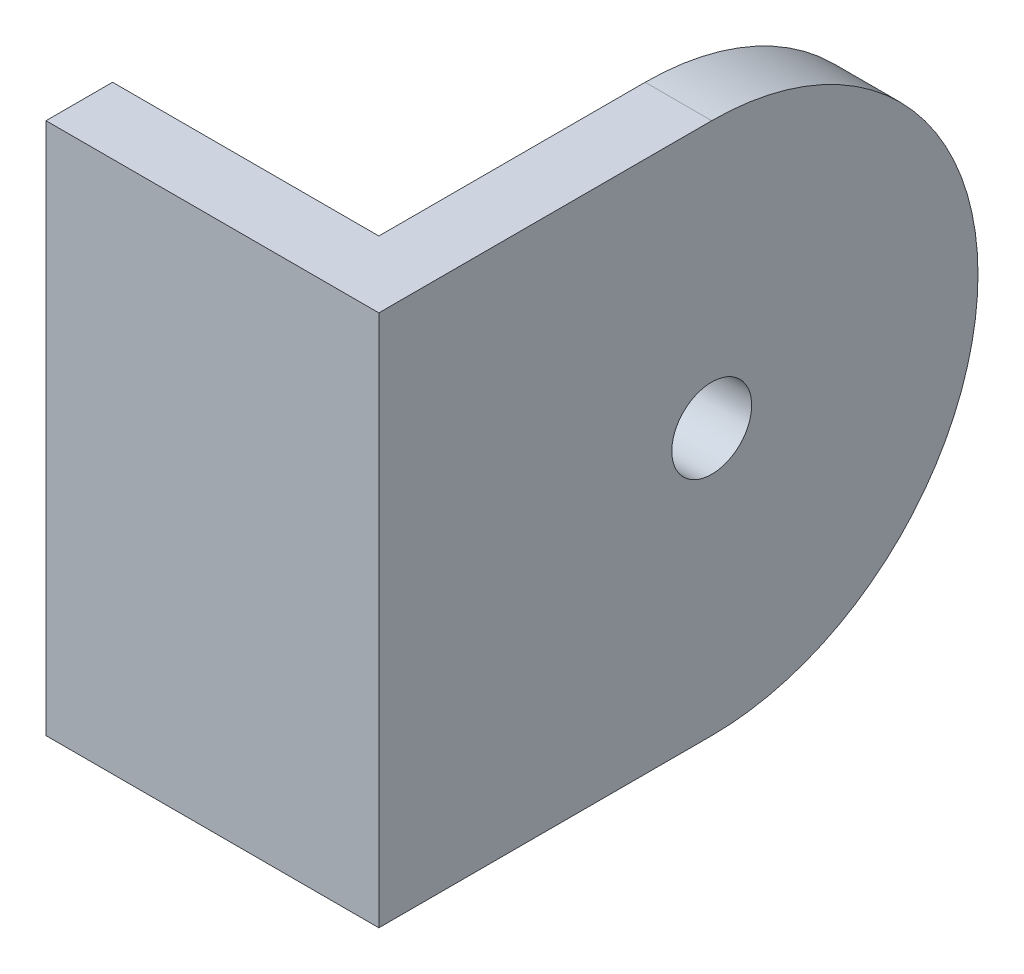
ISO-10303-21;
HEADER;
FILE_DESCRIPTION(('STEP AP214'),'2;1');
FILE_NAME('part.step','',(''),(''),'','','');
FILE_SCHEMA(('AUTOMOTIVE_DESIGN { 1 0 10303 214 1 1 1 1 }'));
ENDSEC;
DATA;
#1=APPLICATION_CONTEXT('core data for automotive mechanical design processes');
#2=APPLICATION_PROTOCOL_DEFINITION('international standard','automotive_design',2000,#1);
#3=PRODUCT_CONTEXT('',#1,'mechanical');
#4=PRODUCT('Part','Part','',(#3));
#5=PRODUCT_RELATED_PRODUCT_CATEGORY('part','',(#4));
#6=PRODUCT_DEFINITION_FORMATION('','',#4);
#7=PRODUCT_DEFINITION_CONTEXT('part definition',#1,'design');
#8=PRODUCT_DEFINITION('design','',#6,#7);
#9=PRODUCT_DEFINITION_SHAPE('','',#8);
#10=(LENGTH_UNIT() NAMED_UNIT(*) SI_UNIT(.MILLI.,.METRE.));
#11=(NAMED_UNIT(*) PLANE_ANGLE_UNIT() SI_UNIT($,.RADIAN.));
#12=(NAMED_UNIT(*) SI_UNIT($,.STERADIAN.) SOLID_ANGLE_UNIT());
#13=UNCERTAINTY_MEASURE_WITH_UNIT(LENGTH_MEASURE(1.E-05),#10,'distance_accuracy_value','');
#14=(GEOMETRIC_REPRESENTATION_CONTEXT(3) GLOBAL_UNCERTAINTY_ASSIGNED_CONTEXT((#13)) GLOBAL_UNIT_ASSIGNED_CONTEXT((#10,
#11,#12)) REPRESENTATION_CONTEXT('',''));
#15=CARTESIAN_POINT('',(0.,0.,0.));
#16=DIRECTION('',(0.,0.,1.));
#17=DIRECTION('',(1.,0.,0.));
#18=AXIS2_PLACEMENT_3D('',#15,#16,#17);
#19=CARTESIAN_POINT('',(-4.41812010102743,20.,24.7985127226701));
#20=DIRECTION('',(1.,0.,0.));
#21=DIRECTION('',(0.,0.,-1.));
#22=AXIS2_PLACEMENT_3D('',#19,#20,#21);
#23=PLANE('',#22);
#24=CARTESIAN_POINT('',(-4.41812010102743,0.,4.79851272267009));
#25=DIRECTION('',(-1.,0.,0.));
#26=DIRECTION('',(0.,0.,1.));
#27=AXIS2_PLACEMENT_3D('',#24,#25,#26);
#28=CIRCLE('',#27,3.);
#29=CARTESIAN_POINT('',(-4.41812010102743,0.,7.79851272267009));
#30=VERTEX_POINT('',#29);
#31=EDGE_CURVE('E251',#30,#30,#28,.T.);
#32=ORIENTED_EDGE('',*,*,#31,.F.);
#33=EDGE_LOOP('',(#32));
#34=FACE_BOUND('',#33,.T.);
#35=DIRECTION('',(0.,0.,1.));
#36=VECTOR('',#35,1.);
#37=CARTESIAN_POINT('',(-4.41812010102743,20.,24.7985127226701));
#38=LINE('',#37,#36);
#39=CARTESIAN_POINT('',(-4.41812010102743,20.,4.79851272267009));
#40=VERTEX_POINT('',#39);
#41=CARTESIAN_POINT('',(-4.41812010102743,20.,24.7985127226701));
#42=VERTEX_POINT('',#41);
#43=EDGE_CURVE('E98',#40,#42,#38,.T.);
#44=ORIENTED_EDGE('',*,*,#43,.F.);
#45=CARTESIAN_POINT('',(-4.41812010102743,0.,4.79851272267009));
#46=DIRECTION('',(1.,0.,0.));
#47=DIRECTION('',(0.,0.,-1.));
#48=AXIS2_PLACEMENT_3D('',#45,#46,#47);
#49=CIRCLE('',#48,20.);
#50=CARTESIAN_POINT('',(-4.41812010102743,0.,-15.2014872773299));
#51=VERTEX_POINT('',#50);
#52=EDGE_CURVE('E49',#40,#51,#49,.F.);
#53=ORIENTED_EDGE('',*,*,#52,.T.);
#54=CARTESIAN_POINT('',(-4.41812010102743,0.,4.79851272267009));
#55=DIRECTION('',(1.,0.,0.));
#56=DIRECTION('',(0.,0.,-1.));
#57=AXIS2_PLACEMENT_3D('',#54,#55,#56);
#58=CIRCLE('',#57,20.);
#59=CARTESIAN_POINT('',(-4.41812010102743,-20.,4.79851272267009));
#60=VERTEX_POINT('',#59);
#61=EDGE_CURVE('E127',#51,#60,#58,.F.);
#62=ORIENTED_EDGE('',*,*,#61,.T.);
#63=DIRECTION('',(0.,0.,1.));
#64=VECTOR('',#63,1.);
#65=CARTESIAN_POINT('',(-4.41812010102743,-20.,24.7985127226701));
#66=LINE('',#65,#64);
#67=CARTESIAN_POINT('',(-4.41812010102743,-20.,24.7985127226701));
#68=VERTEX_POINT('',#67);
#69=EDGE_CURVE('E120',#60,#68,#66,.T.);
#70=ORIENTED_EDGE('',*,*,#69,.T.);
#71=DIRECTION('',(0.,-1.,0.));
#72=VECTOR('',#71,1.);
#73=CARTESIAN_POINT('',(-4.41812010102743,20.,24.7985127226701));
#74=LINE('',#73,#72);
#75=EDGE_CURVE('E112',#42,#68,#74,.T.);
#76=ORIENTED_EDGE('',*,*,#75,.F.);
#77=EDGE_LOOP('',(#44,#53,#62,#70,#76));
#78=FACE_BOUND('',#77,.T.);
#79=ADVANCED_FACE('F39',(#34,#78),#23,.F.);
#80=CARTESIAN_POINT('',(-24.4181201010274,20.,24.7985127226701));
#81=DIRECTION('',(0.,0.,1.));
#82=DIRECTION('',(1.,0.,0.));
#83=AXIS2_PLACEMENT_3D('',#80,#81,#82);
#84=PLANE('',#83);
#85=DIRECTION('',(-1.,0.,0.));
#86=VECTOR('',#85,1.);
#87=CARTESIAN_POINT('',(-24.4181201010274,-20.,24.7985127226701));
#88=LINE('',#87,#86);
#89=CARTESIAN_POINT('',(-24.4181201010274,-20.,24.7985127226701));
#90=VERTEX_POINT('',#89);
#91=EDGE_CURVE('E243',#68,#90,#88,.T.);
#92=ORIENTED_EDGE('',*,*,#91,.T.);
#93=DIRECTION('',(0.,-1.,0.));
#94=VECTOR('',#93,1.);
#95=CARTESIAN_POINT('',(-24.4181201010274,20.,24.7985127226701));
#96=LINE('',#95,#94);
#97=CARTESIAN_POINT('',(-24.4181201010274,20.,24.7985127226701));
#98=VERTEX_POINT('',#97);
#99=EDGE_CURVE('E114',#98,#90,#96,.T.);
#100=ORIENTED_EDGE('',*,*,#99,.F.);
#101=DIRECTION('',(-1.,0.,0.));
#102=VECTOR('',#101,1.);
#103=CARTESIAN_POINT('',(-24.4181201010274,20.,24.7985127226701));
#104=LINE('',#103,#102);
#105=EDGE_CURVE('E101',#42,#98,#104,.T.);
#106=ORIENTED_EDGE('',*,*,#105,.F.);
#107=ORIENTED_EDGE('',*,*,#75,.T.);
#108=EDGE_LOOP('',(#92,#100,#106,#107));
#109=FACE_BOUND('',#108,.T.);
#110=ADVANCED_FACE('F111',(#109),#84,.F.);
#111=CARTESIAN_POINT('',(-24.4181201010274,20.,29.7985127226701));
#112=DIRECTION('',(1.,0.,0.));
#113=DIRECTION('',(0.,0.,-1.));
#114=AXIS2_PLACEMENT_3D('',#111,#112,#113);
#115=PLANE('',#114);
#116=DIRECTION('',(0.,0.,1.));
#117=VECTOR('',#116,1.);
#118=CARTESIAN_POINT('',(-24.4181201010274,-20.,29.7985127226701));
#119=LINE('',#118,#117);
#120=CARTESIAN_POINT('',(-24.4181201010274,-20.,29.7985127226701));
#121=VERTEX_POINT('',#120);
#122=EDGE_CURVE('E248',#90,#121,#119,.T.);
#123=ORIENTED_EDGE('',*,*,#122,.T.);
#124=DIRECTION('',(0.,-1.,0.));
#125=VECTOR('',#124,1.);
#126=CARTESIAN_POINT('',(-24.4181201010274,20.,29.7985127226701));
#127=LINE('',#126,#125);
#128=CARTESIAN_POINT('',(-24.4181201010274,20.,29.7985127226701));
#129=VERTEX_POINT('',#128);
#130=EDGE_CURVE('E129',#129,#121,#127,.T.);
#131=ORIENTED_EDGE('',*,*,#130,.F.);
#132=DIRECTION('',(0.,0.,1.));
#133=VECTOR('',#132,1.);
#134=CARTESIAN_POINT('',(-24.4181201010274,20.,29.7985127226701));
#135=LINE('',#134,#133);
#136=EDGE_CURVE('E117',#98,#129,#135,.T.);
#137=ORIENTED_EDGE('',*,*,#136,.F.);
#138=ORIENTED_EDGE('',*,*,#99,.T.);
#139=EDGE_LOOP('',(#123,#131,#137,#138));
#140=FACE_BOUND('',#139,.T.);
#141=ADVANCED_FACE('F165',(#140),#115,.F.);
#142=CARTESIAN_POINT('',(0.581879898972572,20.,29.7985127226701));
#143=DIRECTION('',(0.,0.,-1.));
#144=DIRECTION('',(-1.,0.,0.));
#145=AXIS2_PLACEMENT_3D('',#142,#143,#144);
#146=PLANE('',#145);
#147=DIRECTION('',(1.,0.,0.));
#148=VECTOR('',#147,1.);
#149=CARTESIAN_POINT('',(0.581879898972572,-20.,29.7985127226701));
#150=LINE('',#149,#148);
#151=CARTESIAN_POINT('',(0.581879898972572,-20.,29.7985127226701));
#152=VERTEX_POINT('',#151);
#153=EDGE_CURVE('E258',#121,#152,#150,.T.);
#154=ORIENTED_EDGE('',*,*,#153,.T.);
#155=DIRECTION('',(0.,-1.,0.));
#156=VECTOR('',#155,1.);
#157=CARTESIAN_POINT('',(0.581879898972572,20.,29.7985127226701));
#158=LINE('',#157,#156);
#159=CARTESIAN_POINT('',(0.581879898972572,20.,29.7985127226701));
#160=VERTEX_POINT('',#159);
#161=EDGE_CURVE('E263',#160,#152,#158,.T.);
#162=ORIENTED_EDGE('',*,*,#161,.F.);
#163=DIRECTION('',(1.,0.,0.));
#164=VECTOR('',#163,1.);
#165=CARTESIAN_POINT('',(0.581879898972572,20.,29.7985127226701));
#166=LINE('',#165,#164);
#167=EDGE_CURVE('E272',#129,#160,#166,.T.);
#168=ORIENTED_EDGE('',*,*,#167,.F.);
#169=ORIENTED_EDGE('',*,*,#130,.T.);
#170=EDGE_LOOP('',(#154,#162,#168,#169));
#171=FACE_BOUND('',#170,.T.);
#172=ADVANCED_FACE('F171',(#171),#146,.F.);
#173=CARTESIAN_POINT('',(0.581879898972567,20.,-15.2014872773299));
#174=DIRECTION('',(-1.,0.,0.));
#175=DIRECTION('',(0.,0.,1.));
#176=AXIS2_PLACEMENT_3D('',#173,#174,#175);
#177=PLANE('',#176);
#178=CARTESIAN_POINT('',(0.581879898972564,0.,4.79851272267009));
#179=DIRECTION('',(-1.,0.,0.));
#180=DIRECTION('',(0.,0.,1.));
#181=AXIS2_PLACEMENT_3D('',#178,#179,#180);
#182=CIRCLE('',#181,3.);
#183=CARTESIAN_POINT('',(0.581879898972564,0.,7.79851272267009));
#184=VERTEX_POINT('',#183);
#185=EDGE_CURVE('E43',#184,#184,#182,.T.);
#186=ORIENTED_EDGE('',*,*,#185,.T.);
#187=EDGE_LOOP('',(#186));
#188=FACE_BOUND('',#187,.T.);
#189=CARTESIAN_POINT('',(0.58187989897257,0.,4.79851272267009));
#190=DIRECTION('',(-1.,0.,0.));
#191=DIRECTION('',(0.,0.,1.));
#192=AXIS2_PLACEMENT_3D('',#189,#190,#191);
#193=CIRCLE('',#192,20.);
#194=CARTESIAN_POINT('',(0.581879898972569,-20.,4.79851272267009));
#195=VERTEX_POINT('',#194);
#196=CARTESIAN_POINT('',(0.581879898972567,0.,-15.2014872773299));
#197=VERTEX_POINT('',#196);
#198=EDGE_CURVE('E138',#195,#197,#193,.F.);
#199=ORIENTED_EDGE('',*,*,#198,.T.);
#200=CARTESIAN_POINT('',(0.581879898972569,0.,4.79851272267009));
#201=DIRECTION('',(-1.,0.,0.));
#202=DIRECTION('',(0.,0.,1.));
#203=AXIS2_PLACEMENT_3D('',#200,#201,#202);
#204=CIRCLE('',#203,20.);
#205=CARTESIAN_POINT('',(0.581879898972569,20.,4.79851272267009));
#206=VERTEX_POINT('',#205);
#207=EDGE_CURVE('E11',#197,#206,#204,.F.);
#208=ORIENTED_EDGE('',*,*,#207,.T.);
#209=DIRECTION('',(0.,0.,-1.));
#210=VECTOR('',#209,1.);
#211=CARTESIAN_POINT('',(0.581879898972567,20.,-15.2014872773299));
#212=LINE('',#211,#210);
#213=EDGE_CURVE('E253',#160,#206,#212,.T.);
#214=ORIENTED_EDGE('',*,*,#213,.F.);
#215=ORIENTED_EDGE('',*,*,#161,.T.);
#216=DIRECTION('',(0.,0.,-1.));
#217=VECTOR('',#216,1.);
#218=CARTESIAN_POINT('',(0.581879898972567,-20.,-15.2014872773299));
#219=LINE('',#218,#217);
#220=EDGE_CURVE('E107',#152,#195,#219,.T.);
#221=ORIENTED_EDGE('',*,*,#220,.T.);
#222=EDGE_LOOP('',(#199,#208,#214,#215,#221));
#223=FACE_BOUND('',#222,.T.);
#224=ADVANCED_FACE('F175',(#188,#223),#177,.F.);
#225=CARTESIAN_POINT('',(0.,20.,0.));
#226=DIRECTION('',(0.,-1.,0.));
#227=DIRECTION('',(0.,0.,-1.));
#228=AXIS2_PLACEMENT_3D('',#225,#226,#227);
#229=PLANE('',#228);
#230=ORIENTED_EDGE('',*,*,#213,.T.);
#231=DIRECTION('',(-1.,0.,0.));
#232=VECTOR('',#231,1.);
#233=CARTESIAN_POINT('',(0.,20.,4.79851272267009));
#234=LINE('',#233,#232);
#235=EDGE_CURVE('E103',#206,#40,#234,.T.);
#236=ORIENTED_EDGE('',*,*,#235,.T.);
#237=ORIENTED_EDGE('',*,*,#43,.T.);
#238=ORIENTED_EDGE('',*,*,#105,.T.);
#239=ORIENTED_EDGE('',*,*,#136,.T.);
#240=ORIENTED_EDGE('',*,*,#167,.T.);
#241=EDGE_LOOP('',(#230,#236,#237,#238,#239,#240));
#242=FACE_BOUND('',#241,.T.);
#243=ADVANCED_FACE('F100',(#242),#229,.F.);
#244=CARTESIAN_POINT('',(0.,-20.,0.));
#245=DIRECTION('',(0.,-1.,0.));
#246=DIRECTION('',(0.,0.,-1.));
#247=AXIS2_PLACEMENT_3D('',#244,#245,#246);
#248=PLANE('',#247);
#249=ORIENTED_EDGE('',*,*,#69,.F.);
#250=DIRECTION('',(-1.,0.,0.));
#251=VECTOR('',#250,1.);
#252=CARTESIAN_POINT('',(0.581879898972567,-20.,4.79851272267009));
#253=LINE('',#252,#251);
#254=EDGE_CURVE('E135',#60,#195,#253,.F.);
#255=ORIENTED_EDGE('',*,*,#254,.T.);
#256=ORIENTED_EDGE('',*,*,#220,.F.);
#257=ORIENTED_EDGE('',*,*,#153,.F.);
#258=ORIENTED_EDGE('',*,*,#122,.F.);
#259=ORIENTED_EDGE('',*,*,#91,.F.);
#260=EDGE_LOOP('',(#249,#255,#256,#257,#258,#259));
#261=FACE_BOUND('',#260,.T.);
#262=ADVANCED_FACE('F158',(#261),#248,.T.);
#263=CARTESIAN_POINT('',(-4.41812010102743,0.,4.79851272267009));
#264=DIRECTION('',(1.,0.,0.));
#265=DIRECTION('',(0.,0.,-1.));
#266=AXIS2_PLACEMENT_3D('',#263,#264,#265);
#267=CYLINDRICAL_SURFACE('',#266,20.);
#268=ORIENTED_EDGE('',*,*,#198,.F.);
#269=ORIENTED_EDGE('',*,*,#254,.F.);
#270=ORIENTED_EDGE('',*,*,#61,.F.);
#271=DIRECTION('',(-1.,0.,0.));
#272=VECTOR('',#271,1.);
#273=CARTESIAN_POINT('',(-4.41812010102743,0.,-15.2014872773299));
#274=LINE('',#273,#272);
#275=EDGE_CURVE('E123',#197,#51,#274,.T.);
#276=ORIENTED_EDGE('',*,*,#275,.F.);
#277=EDGE_LOOP('',(#268,#269,#270,#276));
#278=FACE_BOUND('',#277,.T.);
#279=ADVANCED_FACE('F149',(#278),#267,.T.);
#280=CARTESIAN_POINT('',(0.,0.,4.79851272267009));
#281=DIRECTION('',(-1.,0.,0.));
#282=DIRECTION('',(0.,0.,1.));
#283=AXIS2_PLACEMENT_3D('',#280,#281,#282);
#284=CYLINDRICAL_SURFACE('',#283,20.);
#285=ORIENTED_EDGE('',*,*,#207,.F.);
#286=ORIENTED_EDGE('',*,*,#275,.T.);
#287=ORIENTED_EDGE('',*,*,#52,.F.);
#288=ORIENTED_EDGE('',*,*,#235,.F.);
#289=EDGE_LOOP('',(#285,#286,#287,#288));
#290=FACE_BOUND('',#289,.T.);
#291=ADVANCED_FACE('F41',(#290),#284,.T.);
#292=CARTESIAN_POINT('',(35.5818798989726,0.,4.79851272267009));
#293=DIRECTION('',(-1.,0.,0.));
#294=DIRECTION('',(0.,0.,1.));
#295=AXIS2_PLACEMENT_3D('',#292,#293,#294);
#296=CYLINDRICAL_SURFACE('',#295,3.);
#297=ORIENTED_EDGE('',*,*,#31,.T.);
#298=EDGE_LOOP('',(#297));
#299=FACE_BOUND('',#298,.T.);
#300=ORIENTED_EDGE('',*,*,#185,.F.);
#301=EDGE_LOOP('',(#300));
#302=FACE_BOUND('',#301,.T.);
#303=ADVANCED_FACE('F151',(#299,#302),#296,.F.);
#304=CLOSED_SHELL('',(#79,#110,#141,#172,#224,#243,#262,#279,#291,#303));
#305=MANIFOLD_SOLID_BREP('B2',#304);
#306=ADVANCED_BREP_SHAPE_REPRESENTATION('',(#18,#305),#14);
#307=SHAPE_DEFINITION_REPRESENTATION(#9,#306);
ENDSEC;
END-ISO-10303-21;
